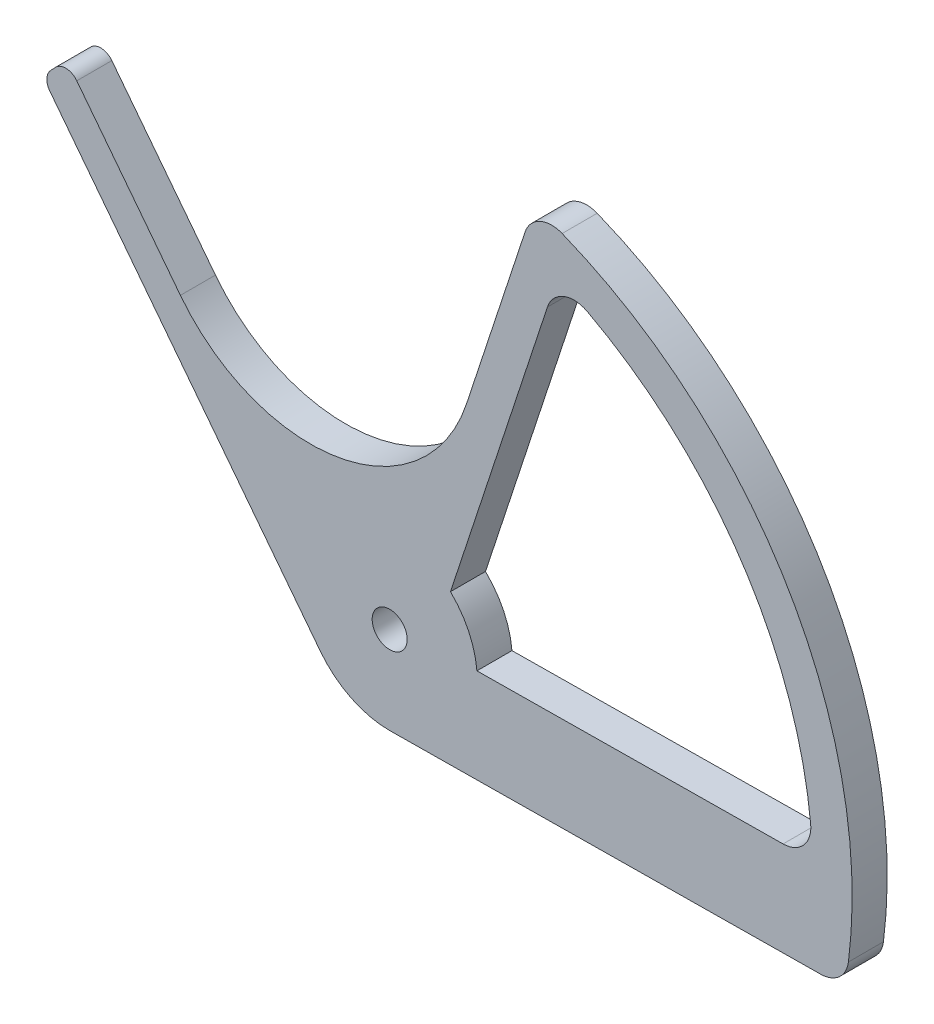
ISO-10303-21;
HEADER;
FILE_DESCRIPTION(('STEP AP214'),'2;1');
FILE_NAME('part.step','',(''),(''),'','','');
FILE_SCHEMA(('AUTOMOTIVE_DESIGN { 1 0 10303 214 1 1 1 1 }'));
ENDSEC;
DATA;
#1=APPLICATION_CONTEXT('core data for automotive mechanical design processes');
#2=APPLICATION_PROTOCOL_DEFINITION('international standard','automotive_design',2000,#1);
#3=PRODUCT_CONTEXT('',#1,'mechanical');
#4=PRODUCT('Part','Part','',(#3));
#5=PRODUCT_RELATED_PRODUCT_CATEGORY('part','',(#4));
#6=PRODUCT_DEFINITION_FORMATION('','',#4);
#7=PRODUCT_DEFINITION_CONTEXT('part definition',#1,'design');
#8=PRODUCT_DEFINITION('design','',#6,#7);
#9=PRODUCT_DEFINITION_SHAPE('','',#8);
#10=(LENGTH_UNIT() NAMED_UNIT(*) SI_UNIT(.MILLI.,.METRE.));
#11=(NAMED_UNIT(*) PLANE_ANGLE_UNIT() SI_UNIT($,.RADIAN.));
#12=(NAMED_UNIT(*) SI_UNIT($,.STERADIAN.) SOLID_ANGLE_UNIT());
#13=UNCERTAINTY_MEASURE_WITH_UNIT(LENGTH_MEASURE(1.E-05),#10,'distance_accuracy_value','');
#14=(GEOMETRIC_REPRESENTATION_CONTEXT(3) GLOBAL_UNCERTAINTY_ASSIGNED_CONTEXT((#13)) GLOBAL_UNIT_ASSIGNED_CONTEXT((#10,
#11,#12)) REPRESENTATION_CONTEXT('',''));
#15=CARTESIAN_POINT('',(0.,0.,0.));
#16=DIRECTION('',(0.,0.,1.));
#17=DIRECTION('',(1.,0.,0.));
#18=AXIS2_PLACEMENT_3D('',#15,#16,#17);
#19=CARTESIAN_POINT('',(-0.0129396714071713,1.24018445357745,6.35));
#20=DIRECTION('',(0.0104330989732619,-0.999945573741798,0.));
#21=DIRECTION('',(0.999945573741798,0.0104330989732619,0.));
#22=AXIS2_PLACEMENT_3D('',#19,#20,#21);
#23=PLANE('',#22);
#24=DIRECTION('',(-0.999945573741798,-0.0104330989732619,0.));
#25=VECTOR('',#24,1.);
#26=CARTESIAN_POINT('',(-0.0129396714071713,1.24018445357745,6.35));
#27=LINE('',#26,#25);
#28=CARTESIAN_POINT('',(71.3019401487095,1.984260150263,6.35));
#29=VERTEX_POINT('',#28);
#30=CARTESIAN_POINT('',(15.8126767694357,1.40530366303838,6.35));
#31=VERTEX_POINT('',#30);
#32=EDGE_CURVE('E219',#29,#31,#27,.T.);
#33=ORIENTED_EDGE('',*,*,#32,.F.);
#34=DIRECTION('',(0.,0.,-1.));
#35=VECTOR('',#34,1.);
#36=CARTESIAN_POINT('',(71.3019401487095,1.984260150263,6.35));
#37=LINE('',#36,#35);
#38=CARTESIAN_POINT('',(71.3019401487095,1.984260150263,0.));
#39=VERTEX_POINT('',#38);
#40=EDGE_CURVE('E287',#29,#39,#37,.T.);
#41=ORIENTED_EDGE('',*,*,#40,.T.);
#42=DIRECTION('',(-0.999945573741798,-0.0104330989732619,0.));
#43=VECTOR('',#42,1.);
#44=CARTESIAN_POINT('',(-0.0129396714071713,1.24018445357745,0.));
#45=LINE('',#44,#43);
#46=CARTESIAN_POINT('',(15.8126767694357,1.40530366303838,0.));
#47=VERTEX_POINT('',#46);
#48=EDGE_CURVE('E265',#39,#47,#45,.T.);
#49=ORIENTED_EDGE('',*,*,#48,.T.);
#50=DIRECTION('',(0.,0.,-1.));
#51=VECTOR('',#50,1.);
#52=CARTESIAN_POINT('',(15.8126767694357,1.40530366303838,6.35));
#53=LINE('',#52,#51);
#54=EDGE_CURVE('E283',#31,#47,#53,.T.);
#55=ORIENTED_EDGE('',*,*,#54,.F.);
#56=EDGE_LOOP('',(#33,#41,#49,#55));
#57=FACE_BOUND('',#56,.T.);
#58=ADVANCED_FACE('F45',(#57),#23,.F.);
#59=CARTESIAN_POINT('',(0.,0.,6.35));
#60=DIRECTION('',(0.,0.,-1.));
#61=DIRECTION('',(-1.,0.,0.));
#62=AXIS2_PLACEMENT_3D('',#59,#60,#61);
#63=CYLINDRICAL_SURFACE('',#62,15.875);
#64=CARTESIAN_POINT('',(0.,0.,0.));
#65=DIRECTION('',(0.,0.,1.));
#66=DIRECTION('',(1.,0.,0.));
#67=AXIS2_PLACEMENT_3D('',#64,#65,#66);
#68=CIRCLE('',#67,15.875);
#69=CARTESIAN_POINT('',(11.0162188300209,11.4305969961806,0.));
#70=VERTEX_POINT('',#69);
#71=EDGE_CURVE('E268',#47,#70,#68,.T.);
#72=ORIENTED_EDGE('',*,*,#71,.T.);
#73=DIRECTION('',(0.,0.,-1.));
#74=VECTOR('',#73,1.);
#75=CARTESIAN_POINT('',(11.0162188300209,11.4305969961806,6.35));
#76=LINE('',#75,#74);
#77=CARTESIAN_POINT('',(11.0162188300209,11.4305969961806,6.35));
#78=VERTEX_POINT('',#77);
#79=EDGE_CURVE('E197',#78,#70,#76,.T.);
#80=ORIENTED_EDGE('',*,*,#79,.F.);
#81=CARTESIAN_POINT('',(0.,0.,6.35));
#82=DIRECTION('',(0.,0.,1.));
#83=DIRECTION('',(1.,0.,0.));
#84=AXIS2_PLACEMENT_3D('',#81,#82,#83);
#85=CIRCLE('',#84,15.875);
#86=EDGE_CURVE('E222',#31,#78,#85,.T.);
#87=ORIENTED_EDGE('',*,*,#86,.F.);
#88=ORIENTED_EDGE('',*,*,#54,.T.);
#89=EDGE_LOOP('',(#72,#80,#87,#88));
#90=FACE_BOUND('',#89,.T.);
#91=ADVANCED_FACE('F394',(#90),#63,.T.);
#92=CARTESIAN_POINT('',(6.55114312353608,-2.15337273235768,6.35));
#93=DIRECTION('',(0.949995004992478,-0.312265096495496,0.));
#94=DIRECTION('',(0.312265096495496,0.949995004992478,0.));
#95=AXIS2_PLACEMENT_3D('',#92,#93,#94);
#96=PLANE('',#95);
#97=DIRECTION('',(-0.312265096495496,-0.949995004992478,0.));
#98=VECTOR('',#97,1.);
#99=CARTESIAN_POINT('',(6.55114312353608,-2.15337273235768,0.));
#100=LINE('',#99,#98);
#101=CARTESIAN_POINT('',(28.5938018208218,64.9063655931438,0.));
#102=VERTEX_POINT('',#101);
#103=EDGE_CURVE('E272',#102,#70,#100,.T.);
#104=ORIENTED_EDGE('',*,*,#103,.F.);
#105=DIRECTION('',(0.,0.,1.));
#106=VECTOR('',#105,1.);
#107=CARTESIAN_POINT('',(28.5938018208218,64.9063655931438,6.35));
#108=LINE('',#107,#106);
#109=CARTESIAN_POINT('',(28.5938018208218,64.9063655931438,6.35));
#110=VERTEX_POINT('',#109);
#111=EDGE_CURVE('E306',#102,#110,#108,.T.);
#112=ORIENTED_EDGE('',*,*,#111,.T.);
#113=DIRECTION('',(-0.312265096495496,-0.949995004992478,0.));
#114=VECTOR('',#113,1.);
#115=CARTESIAN_POINT('',(6.55114312353608,-2.15337273235768,6.35));
#116=LINE('',#115,#114);
#117=EDGE_CURVE('E226',#110,#78,#116,.T.);
#118=ORIENTED_EDGE('',*,*,#117,.T.);
#119=ORIENTED_EDGE('',*,*,#79,.T.);
#120=EDGE_LOOP('',(#104,#112,#118,#119));
#121=FACE_BOUND('',#120,.T.);
#122=ADVANCED_FACE('F400',(#121),#96,.T.);
#123=CARTESIAN_POINT('',(0.165616431827233,-15.8732720133273,6.35));
#124=DIRECTION('',(-0.0104330989732619,0.999945573741798,0.));
#125=DIRECTION('',(-0.999945573741798,-0.0104330989732619,0.));
#126=AXIS2_PLACEMENT_3D('',#123,#124,#125);
#127=PLANE('',#126);
#128=DIRECTION('',(0.999945573741798,0.0104330989732619,0.));
#129=VECTOR('',#128,1.);
#130=CARTESIAN_POINT('',(0.165616431827233,-15.8732720133273,0.));
#131=LINE('',#130,#129);
#132=CARTESIAN_POINT('',(0.,-15.875,0.));
#133=VERTEX_POINT('',#132);
#134=CARTESIAN_POINT('',(78.1580009633928,-15.0595254571686,0.));
#135=VERTEX_POINT('',#134);
#136=EDGE_CURVE('E238',#133,#135,#131,.T.);
#137=ORIENTED_EDGE('',*,*,#136,.T.);
#138=DIRECTION('',(0.,0.,-1.));
#139=VECTOR('',#138,1.);
#140=CARTESIAN_POINT('',(78.1580009633928,-15.0595254571686,6.35));
#141=LINE('',#140,#139);
#142=CARTESIAN_POINT('',(78.1580009633928,-15.0595254571686,6.35));
#143=VERTEX_POINT('',#142);
#144=EDGE_CURVE('E322',#135,#143,#141,.F.);
#145=ORIENTED_EDGE('',*,*,#144,.T.);
#146=DIRECTION('',(0.999945573741798,0.0104330989732619,0.));
#147=VECTOR('',#146,1.);
#148=CARTESIAN_POINT('',(0.165616431827233,-15.8732720133273,6.35));
#149=LINE('',#148,#147);
#150=CARTESIAN_POINT('',(0.,-15.875,6.35));
#151=VERTEX_POINT('',#150);
#152=EDGE_CURVE('E640',#151,#143,#149,.T.);
#153=ORIENTED_EDGE('',*,*,#152,.F.);
#154=DIRECTION('',(0.,0.,-1.));
#155=VECTOR('',#154,1.);
#156=CARTESIAN_POINT('',(0.,-15.875,6.35));
#157=LINE('',#156,#155);
#158=EDGE_CURVE('E233',#151,#133,#157,.T.);
#159=ORIENTED_EDGE('',*,*,#158,.T.);
#160=EDGE_LOOP('',(#137,#145,#153,#159));
#161=FACE_BOUND('',#160,.T.);
#162=ADVANCED_FACE('F425',(#161),#127,.F.);
#163=CARTESIAN_POINT('',(0.,0.,6.35));
#164=DIRECTION('',(0.,0.,-1.));
#165=DIRECTION('',(-1.,0.,0.));
#166=AXIS2_PLACEMENT_3D('',#163,#164,#165);
#167=CYLINDRICAL_SURFACE('',#166,83.82);
#168=CARTESIAN_POINT('',(0.,0.,6.35));
#169=DIRECTION('',(0.,0.,1.));
#170=DIRECTION('',(1.,0.,0.));
#171=AXIS2_PLACEMENT_3D('',#168,#169,#170);
#172=CIRCLE('',#171,83.82);
#173=CARTESIAN_POINT('',(83.1440331316156,-10.6236601324029,6.35));
#174=VERTEX_POINT('',#173);
#175=CARTESIAN_POINT('',(31.2568588635451,77.7740392032227,6.35));
#176=VERTEX_POINT('',#175);
#177=EDGE_CURVE('E186',#174,#176,#172,.T.);
#178=ORIENTED_EDGE('',*,*,#177,.F.);
#179=DIRECTION('',(0.,0.,-1.));
#180=VECTOR('',#179,1.);
#181=CARTESIAN_POINT('',(83.1440331316156,-10.6236601324029,6.35));
#182=LINE('',#181,#180);
#183=CARTESIAN_POINT('',(83.1440331316156,-10.6236601324029,0.));
#184=VERTEX_POINT('',#183);
#185=EDGE_CURVE('E312',#174,#184,#182,.T.);
#186=ORIENTED_EDGE('',*,*,#185,.T.);
#187=CARTESIAN_POINT('',(0.,0.,0.));
#188=DIRECTION('',(0.,0.,1.));
#189=DIRECTION('',(1.,0.,0.));
#190=AXIS2_PLACEMENT_3D('',#187,#188,#189);
#191=CIRCLE('',#190,83.82);
#192=CARTESIAN_POINT('',(31.2568588635451,77.7740392032227,0.));
#193=VERTEX_POINT('',#192);
#194=EDGE_CURVE('E242',#184,#193,#191,.T.);
#195=ORIENTED_EDGE('',*,*,#194,.T.);
#196=DIRECTION('',(0.,0.,-1.));
#197=VECTOR('',#196,1.);
#198=CARTESIAN_POINT('',(31.2568588635451,77.7740392032227,6.35));
#199=LINE('',#198,#197);
#200=EDGE_CURVE('E309',#193,#176,#199,.F.);
#201=ORIENTED_EDGE('',*,*,#200,.T.);
#202=EDGE_LOOP('',(#178,#186,#195,#201));
#203=FACE_BOUND('',#202,.T.);
#204=ADVANCED_FACE('F380',(#203),#167,.T.);
#205=CARTESIAN_POINT('',(0.,0.,6.35));
#206=DIRECTION('',(0.949995004992478,-0.312265096495496,0.));
#207=DIRECTION('',(0.312265096495496,0.949995004992478,0.));
#208=AXIS2_PLACEMENT_3D('',#205,#206,#207);
#209=PLANE('',#208);
#210=DIRECTION('',(-0.312265096495496,-0.949995004992478,0.));
#211=VECTOR('',#210,1.);
#212=CARTESIAN_POINT('',(0.,0.,6.35));
#213=LINE('',#212,#211);
#214=CARTESIAN_POINT('',(24.5365291555442,74.6467677598912,6.35));
#215=VERTEX_POINT('',#214);
#216=CARTESIAN_POINT('',(13.9364133879898,42.3983444025149,6.35));
#217=VERTEX_POINT('',#216);
#218=EDGE_CURVE('E173',#215,#217,#213,.T.);
#219=ORIENTED_EDGE('',*,*,#218,.F.);
#220=DIRECTION('',(0.,0.,-1.));
#221=VECTOR('',#220,1.);
#222=CARTESIAN_POINT('',(24.5365291555442,74.6467677598912,6.35));
#223=LINE('',#222,#221);
#224=CARTESIAN_POINT('',(24.5365291555442,74.6467677598912,0.));
#225=VERTEX_POINT('',#224);
#226=EDGE_CURVE('E330',#215,#225,#223,.T.);
#227=ORIENTED_EDGE('',*,*,#226,.T.);
#228=DIRECTION('',(-0.312265096495496,-0.949995004992478,0.));
#229=VECTOR('',#228,1.);
#230=CARTESIAN_POINT('',(0.,0.,0.));
#231=LINE('',#230,#229);
#232=CARTESIAN_POINT('',(13.9364133879898,42.3983444025149,0.));
#233=VERTEX_POINT('',#232);
#234=EDGE_CURVE('E192',#225,#233,#231,.T.);
#235=ORIENTED_EDGE('',*,*,#234,.T.);
#236=DIRECTION('',(0.,0.,-1.));
#237=VECTOR('',#236,1.);
#238=CARTESIAN_POINT('',(13.9364133879898,42.3983444025149,6.35));
#239=LINE('',#238,#237);
#240=EDGE_CURVE('E189',#217,#233,#239,.T.);
#241=ORIENTED_EDGE('',*,*,#240,.F.);
#242=EDGE_LOOP('',(#219,#227,#235,#241));
#243=FACE_BOUND('',#242,.T.);
#244=ADVANCED_FACE('F190',(#243),#209,.F.);
#245=CARTESIAN_POINT('',(-14.3647786939929,51.7009980269809,6.35));
#246=DIRECTION('',(0.,0.,-1.));
#247=DIRECTION('',(-1.,0.,0.));
#248=AXIS2_PLACEMENT_3D('',#245,#246,#247);
#249=CYLINDRICAL_SURFACE('',#248,29.7908851449242);
#250=CARTESIAN_POINT('',(-14.3647786939929,51.7009980269809,0.));
#251=DIRECTION('',(0.,0.,1.));
#252=DIRECTION('',(1.,0.,0.));
#253=AXIS2_PLACEMENT_3D('',#250,#251,#252);
#254=CIRCLE('',#253,29.7908851449242);
#255=CARTESIAN_POINT('',(-37.9304988295191,33.4759144273888,0.));
#256=VERTEX_POINT('',#255);
#257=EDGE_CURVE('E248',#256,#233,#254,.T.);
#258=ORIENTED_EDGE('',*,*,#257,.F.);
#259=DIRECTION('',(0.,0.,-1.));
#260=VECTOR('',#259,1.);
#261=CARTESIAN_POINT('',(-37.9304988295191,33.4759144273888,6.35));
#262=LINE('',#261,#260);
#263=CARTESIAN_POINT('',(-37.9304988295191,33.4759144273888,6.35));
#264=VERTEX_POINT('',#263);
#265=EDGE_CURVE('E198',#264,#256,#262,.T.);
#266=ORIENTED_EDGE('',*,*,#265,.F.);
#267=CARTESIAN_POINT('',(-14.3647786939929,51.7009980269809,6.35));
#268=DIRECTION('',(0.,0.,1.));
#269=DIRECTION('',(1.,0.,0.));
#270=AXIS2_PLACEMENT_3D('',#267,#268,#269);
#271=CIRCLE('',#270,29.7908851449242);
#272=EDGE_CURVE('E178',#264,#217,#271,.T.);
#273=ORIENTED_EDGE('',*,*,#272,.T.);
#274=ORIENTED_EDGE('',*,*,#240,.T.);
#275=EDGE_LOOP('',(#258,#266,#273,#274));
#276=FACE_BOUND('',#275,.T.);
#277=ADVANCED_FACE('F201',(#276),#249,.F.);
#278=CARTESIAN_POINT('',(-7.53463628888287,-5.82708168762456,6.35));
#279=DIRECTION('',(0.791037930591377,0.611767106312289,0.));
#280=DIRECTION('',(-0.611767106312289,0.791037930591377,0.));
#281=AXIS2_PLACEMENT_3D('',#278,#279,#280);
#282=PLANE('',#281);
#283=DIRECTION('',(0.611767106312289,-0.791037930591377,0.));
#284=VECTOR('',#283,1.);
#285=CARTESIAN_POINT('',(-7.53463628888287,-5.82708168762456,0.));
#286=LINE('',#285,#284);
#287=CARTESIAN_POINT('',(-56.7082090545174,57.7562016222428,0.));
#288=VERTEX_POINT('',#287);
#289=EDGE_CURVE('E251',#288,#256,#286,.T.);
#290=ORIENTED_EDGE('',*,*,#289,.F.);
#291=DIRECTION('',(0.,0.,1.));
#292=VECTOR('',#291,1.);
#293=CARTESIAN_POINT('',(-56.7082090545174,57.7562016222427,6.35));
#294=LINE('',#293,#292);
#295=CARTESIAN_POINT('',(-56.7082090545174,57.7562016222428,6.35));
#296=VERTEX_POINT('',#295);
#297=EDGE_CURVE('E69',#288,#296,#294,.T.);
#298=ORIENTED_EDGE('',*,*,#297,.T.);
#299=DIRECTION('',(0.611767106312289,-0.791037930591377,0.));
#300=VECTOR('',#299,1.);
#301=CARTESIAN_POINT('',(-7.53463628888287,-5.82708168762456,6.35));
#302=LINE('',#301,#300);
#303=EDGE_CURVE('E204',#296,#264,#302,.T.);
#304=ORIENTED_EDGE('',*,*,#303,.T.);
#305=ORIENTED_EDGE('',*,*,#265,.T.);
#306=EDGE_LOOP('',(#290,#298,#304,#305));
#307=FACE_BOUND('',#306,.T.);
#308=ADVANCED_FACE('F374',(#307),#282,.T.);
#309=CARTESIAN_POINT('',(0.,0.,6.35));
#310=DIRECTION('',(0.,0.,-1.));
#311=DIRECTION('',(-1.,0.,0.));
#312=AXIS2_PLACEMENT_3D('',#309,#310,#311);
#313=CYLINDRICAL_SURFACE('',#312,83.82);
#314=CARTESIAN_POINT('',(0.,0.,6.35));
#315=DIRECTION('',(0.,0.,1.));
#316=DIRECTION('',(1.,0.,0.));
#317=AXIS2_PLACEMENT_3D('',#314,#315,#316);
#318=CIRCLE('',#317,83.82);
#319=CARTESIAN_POINT('',(-60.5523655669138,57.9586354588411,6.35));
#320=VERTEX_POINT('',#319);
#321=CARTESIAN_POINT('',(-61.461626007097,56.9935165484964,6.35));
#322=VERTEX_POINT('',#321);
#323=EDGE_CURVE('E207',#320,#322,#318,.T.);
#324=ORIENTED_EDGE('',*,*,#323,.F.);
#325=DIRECTION('',(0.,0.,-1.));
#326=VECTOR('',#325,1.);
#327=CARTESIAN_POINT('',(-60.5523655669138,57.9586354588411,6.35));
#328=LINE('',#327,#326);
#329=CARTESIAN_POINT('',(-60.5523655669138,57.9586354588411,0.));
#330=VERTEX_POINT('',#329);
#331=EDGE_CURVE('E348',#320,#330,#328,.T.);
#332=ORIENTED_EDGE('',*,*,#331,.T.);
#333=CARTESIAN_POINT('',(0.,0.,0.));
#334=DIRECTION('',(0.,0.,1.));
#335=DIRECTION('',(1.,0.,0.));
#336=AXIS2_PLACEMENT_3D('',#333,#334,#335);
#337=CIRCLE('',#336,83.82);
#338=CARTESIAN_POINT('',(-61.461626007097,56.9935165484964,0.));
#339=VERTEX_POINT('',#338);
#340=EDGE_CURVE('E254',#330,#339,#337,.T.);
#341=ORIENTED_EDGE('',*,*,#340,.T.);
#342=DIRECTION('',(0.,0.,-1.));
#343=VECTOR('',#342,1.);
#344=CARTESIAN_POINT('',(-61.4616260070971,56.9935165484964,6.35));
#345=LINE('',#344,#343);
#346=EDGE_CURVE('E345',#339,#322,#345,.F.);
#347=ORIENTED_EDGE('',*,*,#346,.T.);
#348=EDGE_LOOP('',(#324,#332,#341,#347));
#349=FACE_BOUND('',#348,.T.);
#350=ADVANCED_FACE('F367',(#349),#313,.T.);
#351=CARTESIAN_POINT('',(-12.5577271481381,-9.71180281270759,6.35));
#352=DIRECTION('',(-0.791037930591377,-0.611767106312289,0.));
#353=DIRECTION('',(0.611767106312289,-0.791037930591377,0.));
#354=AXIS2_PLACEMENT_3D('',#351,#352,#353);
#355=PLANE('',#354);
#356=DIRECTION('',(-0.611767106312289,0.791037930591377,0.));
#357=VECTOR('',#356,1.);
#358=CARTESIAN_POINT('',(-12.5577271481381,-9.71180281270759,6.35));
#359=LINE('',#358,#357);
#360=CARTESIAN_POINT('',(-12.5577271481381,-9.71180281270759,6.35));
#361=VERTEX_POINT('',#360);
#362=CARTESIAN_POINT('',(-61.6083888354326,53.7125518394179,6.35));
#363=VERTEX_POINT('',#362);
#364=EDGE_CURVE('E213',#361,#363,#359,.T.);
#365=ORIENTED_EDGE('',*,*,#364,.T.);
#366=DIRECTION('',(0.,0.,1.));
#367=VECTOR('',#366,1.);
#368=CARTESIAN_POINT('',(-61.6083888354326,53.7125518394178,0.));
#369=LINE('',#368,#367);
#370=CARTESIAN_POINT('',(-61.6083888354326,53.7125518394179,0.));
#371=VERTEX_POINT('',#370);
#372=EDGE_CURVE('E11',#363,#371,#369,.F.);
#373=ORIENTED_EDGE('',*,*,#372,.T.);
#374=DIRECTION('',(-0.611767106312289,0.791037930591377,0.));
#375=VECTOR('',#374,1.);
#376=CARTESIAN_POINT('',(-12.5577271481381,-9.71180281270759,0.));
#377=LINE('',#376,#375);
#378=CARTESIAN_POINT('',(-12.5577271481381,-9.71180281270759,0.));
#379=VERTEX_POINT('',#378);
#380=EDGE_CURVE('E258',#379,#371,#377,.T.);
#381=ORIENTED_EDGE('',*,*,#380,.F.);
#382=DIRECTION('',(0.,0.,-1.));
#383=VECTOR('',#382,1.);
#384=CARTESIAN_POINT('',(-12.5577271481381,-9.71180281270759,6.35));
#385=LINE('',#384,#383);
#386=EDGE_CURVE('E291',#361,#379,#385,.T.);
#387=ORIENTED_EDGE('',*,*,#386,.F.);
#388=EDGE_LOOP('',(#365,#373,#381,#387));
#389=FACE_BOUND('',#388,.T.);
#390=ADVANCED_FACE('F410',(#389),#355,.T.);
#391=CARTESIAN_POINT('',(0.,0.,6.35));
#392=DIRECTION('',(0.,0.,-1.));
#393=DIRECTION('',(-1.,0.,0.));
#394=AXIS2_PLACEMENT_3D('',#391,#392,#393);
#395=CYLINDRICAL_SURFACE('',#394,15.875);
#396=CARTESIAN_POINT('',(0.,0.,0.));
#397=DIRECTION('',(0.,0.,1.));
#398=DIRECTION('',(1.,0.,0.));
#399=AXIS2_PLACEMENT_3D('',#396,#397,#398);
#400=CIRCLE('',#399,15.875);
#401=EDGE_CURVE('E262',#379,#133,#400,.T.);
#402=ORIENTED_EDGE('',*,*,#401,.T.);
#403=ORIENTED_EDGE('',*,*,#158,.F.);
#404=CARTESIAN_POINT('',(0.,0.,6.35));
#405=DIRECTION('',(0.,0.,1.));
#406=DIRECTION('',(1.,0.,0.));
#407=AXIS2_PLACEMENT_3D('',#404,#405,#406);
#408=CIRCLE('',#407,15.875);
#409=EDGE_CURVE('E216',#361,#151,#408,.T.);
#410=ORIENTED_EDGE('',*,*,#409,.F.);
#411=ORIENTED_EDGE('',*,*,#386,.T.);
#412=EDGE_LOOP('',(#402,#403,#410,#411));
#413=FACE_BOUND('',#412,.T.);
#414=ADVANCED_FACE('F406',(#413),#395,.T.);
#415=CARTESIAN_POINT('',(0.,0.,6.35));
#416=DIRECTION('',(0.,0.,-1.));
#417=DIRECTION('',(-1.,0.,0.));
#418=AXIS2_PLACEMENT_3D('',#415,#416,#417);
#419=CYLINDRICAL_SURFACE('',#418,3.175);
#420=CARTESIAN_POINT('',(0.,0.,6.35));
#421=DIRECTION('',(0.,0.,1.));
#422=DIRECTION('',(1.,0.,0.));
#423=AXIS2_PLACEMENT_3D('',#420,#421,#422);
#424=CIRCLE('',#423,3.175);
#425=CARTESIAN_POINT('',(3.175,0.,6.35));
#426=VERTEX_POINT('',#425);
#427=EDGE_CURVE('E279',#426,#426,#424,.T.);
#428=ORIENTED_EDGE('',*,*,#427,.T.);
#429=EDGE_LOOP('',(#428));
#430=FACE_BOUND('',#429,.T.);
#431=CARTESIAN_POINT('',(0.,0.,0.));
#432=DIRECTION('',(0.,0.,1.));
#433=DIRECTION('',(1.,0.,0.));
#434=AXIS2_PLACEMENT_3D('',#431,#432,#433);
#435=CIRCLE('',#434,3.175);
#436=CARTESIAN_POINT('',(3.175,0.,0.));
#437=VERTEX_POINT('',#436);
#438=EDGE_CURVE('E234',#437,#437,#435,.T.);
#439=ORIENTED_EDGE('',*,*,#438,.F.);
#440=EDGE_LOOP('',(#439));
#441=FACE_BOUND('',#440,.T.);
#442=ADVANCED_FACE('F409',(#430,#441),#419,.F.);
#443=CARTESIAN_POINT('',(0.,0.,6.35));
#444=DIRECTION('',(0.,0.,-1.));
#445=DIRECTION('',(-1.,0.,0.));
#446=AXIS2_PLACEMENT_3D('',#443,#444,#445);
#447=CYLINDRICAL_SURFACE('',#446,76.6782633671063);
#448=CARTESIAN_POINT('',(0.,0.,0.));
#449=DIRECTION('',(0.,0.,1.));
#450=DIRECTION('',(1.,0.,0.));
#451=AXIS2_PLACEMENT_3D('',#448,#449,#450);
#452=CIRCLE('',#451,76.6782633671063);
#453=CARTESIAN_POINT('',(76.3041550098745,7.56518348914015,0.));
#454=VERTEX_POINT('',#453);
#455=CARTESIAN_POINT('',(35.7909577620786,67.8127083625807,0.));
#456=VERTEX_POINT('',#455);
#457=EDGE_CURVE('E275',#454,#456,#452,.T.);
#458=ORIENTED_EDGE('',*,*,#457,.F.);
#459=DIRECTION('',(0.,0.,-1.));
#460=VECTOR('',#459,1.);
#461=CARTESIAN_POINT('',(76.3041550098745,7.56518348914015,6.35));
#462=LINE('',#461,#460);
#463=CARTESIAN_POINT('',(76.3041550098745,7.56518348914015,6.35));
#464=VERTEX_POINT('',#463);
#465=EDGE_CURVE('E303',#454,#464,#462,.F.);
#466=ORIENTED_EDGE('',*,*,#465,.T.);
#467=CARTESIAN_POINT('',(0.,0.,6.35));
#468=DIRECTION('',(0.,0.,1.));
#469=DIRECTION('',(1.,0.,0.));
#470=AXIS2_PLACEMENT_3D('',#467,#468,#469);
#471=CIRCLE('',#470,76.6782633671063);
#472=CARTESIAN_POINT('',(35.7909577620786,67.8127083625807,6.35));
#473=VERTEX_POINT('',#472);
#474=EDGE_CURVE('E229',#464,#473,#471,.T.);
#475=ORIENTED_EDGE('',*,*,#474,.T.);
#476=DIRECTION('',(0.,0.,-1.));
#477=VECTOR('',#476,1.);
#478=CARTESIAN_POINT('',(35.7909577620786,67.8127083625807,6.35));
#479=LINE('',#478,#477);
#480=EDGE_CURVE('E299',#473,#456,#479,.T.);
#481=ORIENTED_EDGE('',*,*,#480,.T.);
#482=EDGE_LOOP('',(#458,#466,#475,#481));
#483=FACE_BOUND('',#482,.T.);
#484=ADVANCED_FACE('F431',(#483),#447,.F.);
#485=CARTESIAN_POINT('',(0.,0.,6.35));
#486=DIRECTION('',(0.,0.,1.));
#487=DIRECTION('',(1.,0.,0.));
#488=AXIS2_PLACEMENT_3D('',#485,#486,#487);
#489=PLANE('',#488);
#490=ORIENTED_EDGE('',*,*,#427,.F.);
#491=EDGE_LOOP('',(#490));
#492=FACE_BOUND('',#491,.T.);
#493=ORIENTED_EDGE('',*,*,#303,.F.);
#494=CARTESIAN_POINT('',(-58.7174453982195,56.2023131722095,6.35));
#495=DIRECTION('',(0.,0.,1.));
#496=DIRECTION('',(1.,0.,0.));
#497=AXIS2_PLACEMENT_3D('',#494,#495,#496);
#498=CIRCLE('',#497,2.54);
#499=EDGE_CURVE('E54',#296,#320,#498,.T.);
#500=ORIENTED_EDGE('',*,*,#499,.T.);
#501=ORIENTED_EDGE('',*,*,#323,.T.);
#502=CARTESIAN_POINT('',(-59.5991524917305,55.2664402894511,6.35));
#503=DIRECTION('',(0.,0.,1.));
#504=DIRECTION('',(1.,0.,0.));
#505=AXIS2_PLACEMENT_3D('',#502,#503,#504);
#506=CIRCLE('',#505,2.54);
#507=EDGE_CURVE('E61',#322,#363,#506,.T.);
#508=ORIENTED_EDGE('',*,*,#507,.T.);
#509=ORIENTED_EDGE('',*,*,#364,.F.);
#510=ORIENTED_EDGE('',*,*,#409,.T.);
#511=ORIENTED_EDGE('',*,*,#152,.T.);
#512=CARTESIAN_POINT('',(78.1050008206086,-9.97980194256027,6.35));
#513=DIRECTION('',(0.,0.,1.));
#514=DIRECTION('',(1.,0.,0.));
#515=AXIS2_PLACEMENT_3D('',#512,#513,#514);
#516=CIRCLE('',#515,5.08);
#517=EDGE_CURVE('E327',#143,#174,#516,.T.);
#518=ORIENTED_EDGE('',*,*,#517,.T.);
#519=ORIENTED_EDGE('',*,*,#177,.T.);
#520=CARTESIAN_POINT('',(29.362503780906,73.060461069694,6.35));
#521=DIRECTION('',(0.,0.,1.));
#522=DIRECTION('',(1.,0.,0.));
#523=AXIS2_PLACEMENT_3D('',#520,#521,#522);
#524=CIRCLE('',#523,5.08);
#525=EDGE_CURVE('E181',#176,#215,#524,.T.);
#526=ORIENTED_EDGE('',*,*,#525,.T.);
#527=ORIENTED_EDGE('',*,*,#218,.T.);
#528=ORIENTED_EDGE('',*,*,#272,.F.);
#529=EDGE_LOOP('',(#493,#500,#501,#508,#509,#510,#511,#518,#519,#526,#527,#528));
#530=FACE_BOUND('',#529,.T.);
#531=ORIENTED_EDGE('',*,*,#474,.F.);
#532=CARTESIAN_POINT('',(71.2489400059253,7.06398366487133,6.35));
#533=DIRECTION('',(0.,0.,1.));
#534=DIRECTION('',(1.,0.,0.));
#535=AXIS2_PLACEMENT_3D('',#532,#533,#534);
#536=CIRCLE('',#535,5.08);
#537=EDGE_CURVE('E336',#464,#29,#536,.F.);
#538=ORIENTED_EDGE('',*,*,#537,.T.);
#539=ORIENTED_EDGE('',*,*,#32,.T.);
#540=ORIENTED_EDGE('',*,*,#86,.T.);
#541=ORIENTED_EDGE('',*,*,#117,.F.);
#542=CARTESIAN_POINT('',(33.4197764461836,63.3200589029466,6.35));
#543=DIRECTION('',(0.,0.,1.));
#544=DIRECTION('',(1.,0.,0.));
#545=AXIS2_PLACEMENT_3D('',#542,#543,#544);
#546=CIRCLE('',#545,5.08);
#547=EDGE_CURVE('E342',#110,#473,#546,.F.);
#548=ORIENTED_EDGE('',*,*,#547,.T.);
#549=EDGE_LOOP('',(#531,#538,#539,#540,#541,#548));
#550=FACE_BOUND('',#549,.T.);
#551=ADVANCED_FACE('F175',(#492,#530,#550),#489,.T.);
#552=CARTESIAN_POINT('',(0.,0.,0.));
#553=DIRECTION('',(0.,0.,1.));
#554=DIRECTION('',(1.,0.,0.));
#555=AXIS2_PLACEMENT_3D('',#552,#553,#554);
#556=PLANE('',#555);
#557=ORIENTED_EDGE('',*,*,#438,.T.);
#558=EDGE_LOOP('',(#557));
#559=FACE_BOUND('',#558,.T.);
#560=ORIENTED_EDGE('',*,*,#340,.F.);
#561=CARTESIAN_POINT('',(-58.7174453982195,56.2023131722095,0.));
#562=DIRECTION('',(0.,0.,1.));
#563=DIRECTION('',(1.,0.,0.));
#564=AXIS2_PLACEMENT_3D('',#561,#562,#563);
#565=CIRCLE('',#564,2.54);
#566=EDGE_CURVE('E355',#330,#288,#565,.F.);
#567=ORIENTED_EDGE('',*,*,#566,.T.);
#568=ORIENTED_EDGE('',*,*,#289,.T.);
#569=ORIENTED_EDGE('',*,*,#257,.T.);
#570=ORIENTED_EDGE('',*,*,#234,.F.);
#571=CARTESIAN_POINT('',(29.362503780906,73.060461069694,0.));
#572=DIRECTION('',(0.,0.,1.));
#573=DIRECTION('',(1.,0.,0.));
#574=AXIS2_PLACEMENT_3D('',#571,#572,#573);
#575=CIRCLE('',#574,5.08);
#576=EDGE_CURVE('E316',#225,#193,#575,.F.);
#577=ORIENTED_EDGE('',*,*,#576,.T.);
#578=ORIENTED_EDGE('',*,*,#194,.F.);
#579=CARTESIAN_POINT('',(78.1050008206086,-9.97980194256027,0.));
#580=DIRECTION('',(0.,0.,1.));
#581=DIRECTION('',(1.,0.,0.));
#582=AXIS2_PLACEMENT_3D('',#579,#580,#581);
#583=CIRCLE('',#582,5.08);
#584=EDGE_CURVE('E319',#184,#135,#583,.F.);
#585=ORIENTED_EDGE('',*,*,#584,.T.);
#586=ORIENTED_EDGE('',*,*,#136,.F.);
#587=ORIENTED_EDGE('',*,*,#401,.F.);
#588=ORIENTED_EDGE('',*,*,#380,.T.);
#589=CARTESIAN_POINT('',(-59.5991524917305,55.2664402894511,0.));
#590=DIRECTION('',(0.,0.,1.));
#591=DIRECTION('',(1.,0.,0.));
#592=AXIS2_PLACEMENT_3D('',#589,#590,#591);
#593=CIRCLE('',#592,2.54);
#594=EDGE_CURVE('E352',#371,#339,#593,.F.);
#595=ORIENTED_EDGE('',*,*,#594,.T.);
#596=EDGE_LOOP('',(#560,#567,#568,#569,#570,#577,#578,#585,#586,#587,#588,#595));
#597=FACE_BOUND('',#596,.T.);
#598=ORIENTED_EDGE('',*,*,#48,.F.);
#599=CARTESIAN_POINT('',(71.2489400059253,7.06398366487133,0.));
#600=DIRECTION('',(0.,0.,1.));
#601=DIRECTION('',(1.,0.,0.));
#602=AXIS2_PLACEMENT_3D('',#599,#600,#601);
#603=CIRCLE('',#602,5.08);
#604=EDGE_CURVE('E333',#39,#454,#603,.T.);
#605=ORIENTED_EDGE('',*,*,#604,.T.);
#606=ORIENTED_EDGE('',*,*,#457,.T.);
#607=CARTESIAN_POINT('',(33.4197764461836,63.3200589029466,0.));
#608=DIRECTION('',(0.,0.,1.));
#609=DIRECTION('',(1.,0.,0.));
#610=AXIS2_PLACEMENT_3D('',#607,#608,#609);
#611=CIRCLE('',#610,5.08);
#612=EDGE_CURVE('E339',#456,#102,#611,.T.);
#613=ORIENTED_EDGE('',*,*,#612,.T.);
#614=ORIENTED_EDGE('',*,*,#103,.T.);
#615=ORIENTED_EDGE('',*,*,#71,.F.);
#616=EDGE_LOOP('',(#598,#605,#606,#613,#614,#615));
#617=FACE_BOUND('',#616,.T.);
#618=ADVANCED_FACE('F372',(#559,#597,#617),#556,.F.);
#619=CARTESIAN_POINT('',(71.2489400059253,7.06398366487133,6.35));
#620=DIRECTION('',(0.,0.,-1.));
#621=DIRECTION('',(-1.,0.,0.));
#622=AXIS2_PLACEMENT_3D('',#619,#620,#621);
#623=CYLINDRICAL_SURFACE('',#622,5.08);
#624=ORIENTED_EDGE('',*,*,#537,.F.);
#625=ORIENTED_EDGE('',*,*,#465,.F.);
#626=ORIENTED_EDGE('',*,*,#604,.F.);
#627=ORIENTED_EDGE('',*,*,#40,.F.);
#628=EDGE_LOOP('',(#624,#625,#626,#627));
#629=FACE_BOUND('',#628,.T.);
#630=ADVANCED_FACE('F433',(#629),#623,.F.);
#631=CARTESIAN_POINT('',(33.4197764461836,63.3200589029466,6.35));
#632=DIRECTION('',(0.,0.,-1.));
#633=DIRECTION('',(-1.,0.,0.));
#634=AXIS2_PLACEMENT_3D('',#631,#632,#633);
#635=CYLINDRICAL_SURFACE('',#634,5.08);
#636=ORIENTED_EDGE('',*,*,#547,.F.);
#637=ORIENTED_EDGE('',*,*,#111,.F.);
#638=ORIENTED_EDGE('',*,*,#612,.F.);
#639=ORIENTED_EDGE('',*,*,#480,.F.);
#640=EDGE_LOOP('',(#636,#637,#638,#639));
#641=FACE_BOUND('',#640,.T.);
#642=ADVANCED_FACE('F390',(#641),#635,.F.);
#643=CARTESIAN_POINT('',(78.1050008206086,-9.97980194256027,6.35));
#644=DIRECTION('',(0.,0.,-1.));
#645=DIRECTION('',(-1.,0.,0.));
#646=AXIS2_PLACEMENT_3D('',#643,#644,#645);
#647=CYLINDRICAL_SURFACE('',#646,5.08);
#648=ORIENTED_EDGE('',*,*,#517,.F.);
#649=ORIENTED_EDGE('',*,*,#144,.F.);
#650=ORIENTED_EDGE('',*,*,#584,.F.);
#651=ORIENTED_EDGE('',*,*,#185,.F.);
#652=EDGE_LOOP('',(#648,#649,#650,#651));
#653=FACE_BOUND('',#652,.T.);
#654=ADVANCED_FACE('F384',(#653),#647,.T.);
#655=CARTESIAN_POINT('',(29.362503780906,73.060461069694,6.35));
#656=DIRECTION('',(0.,0.,-1.));
#657=DIRECTION('',(-1.,0.,0.));
#658=AXIS2_PLACEMENT_3D('',#655,#656,#657);
#659=CYLINDRICAL_SURFACE('',#658,5.08);
#660=ORIENTED_EDGE('',*,*,#525,.F.);
#661=ORIENTED_EDGE('',*,*,#200,.F.);
#662=ORIENTED_EDGE('',*,*,#576,.F.);
#663=ORIENTED_EDGE('',*,*,#226,.F.);
#664=EDGE_LOOP('',(#660,#661,#662,#663));
#665=FACE_BOUND('',#664,.T.);
#666=ADVANCED_FACE('F382',(#665),#659,.T.);
#667=CARTESIAN_POINT('',(-58.7174453982195,56.2023131722095,6.35));
#668=DIRECTION('',(0.,0.,-1.));
#669=DIRECTION('',(-1.,0.,0.));
#670=AXIS2_PLACEMENT_3D('',#667,#668,#669);
#671=CYLINDRICAL_SURFACE('',#670,2.54);
#672=ORIENTED_EDGE('',*,*,#499,.F.);
#673=ORIENTED_EDGE('',*,*,#297,.F.);
#674=ORIENTED_EDGE('',*,*,#566,.F.);
#675=ORIENTED_EDGE('',*,*,#331,.F.);
#676=EDGE_LOOP('',(#672,#673,#674,#675));
#677=FACE_BOUND('',#676,.T.);
#678=ADVANCED_FACE('F370',(#677),#671,.T.);
#679=CARTESIAN_POINT('',(-59.5991524917305,55.2664402894511,6.35));
#680=DIRECTION('',(0.,0.,-1.));
#681=DIRECTION('',(-1.,0.,0.));
#682=AXIS2_PLACEMENT_3D('',#679,#680,#681);
#683=CYLINDRICAL_SURFACE('',#682,2.54);
#684=ORIENTED_EDGE('',*,*,#507,.F.);
#685=ORIENTED_EDGE('',*,*,#346,.F.);
#686=ORIENTED_EDGE('',*,*,#594,.F.);
#687=ORIENTED_EDGE('',*,*,#372,.F.);
#688=EDGE_LOOP('',(#684,#685,#686,#687));
#689=FACE_BOUND('',#688,.T.);
#690=ADVANCED_FACE('F47',(#689),#683,.T.);
#691=CLOSED_SHELL('',(#58,#91,#122,#162,#204,#244,#277,#308,#350,#390,#414,#442,#484,#551,#618,
#630,#642,#654,#666,#678,#690));
#692=MANIFOLD_SOLID_BREP('B2',#691);
#693=ADVANCED_BREP_SHAPE_REPRESENTATION('',(#18,#692),#14);
#694=SHAPE_DEFINITION_REPRESENTATION(#9,#693);
ENDSEC;
END-ISO-10303-21;
